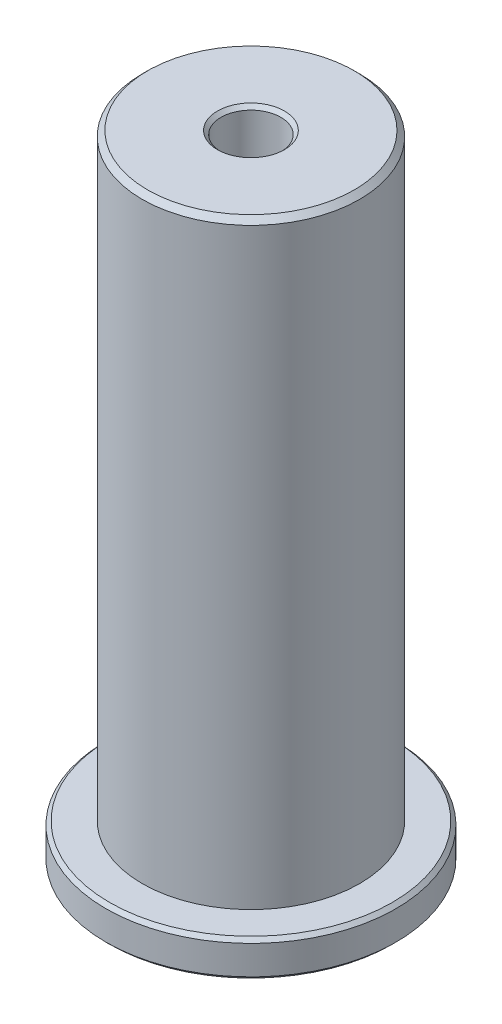
ISO-10303-21;
HEADER;
FILE_DESCRIPTION(('STEP AP214'),'2;1');
FILE_NAME('part.step','',(''),(''),'','','');
FILE_SCHEMA(('AUTOMOTIVE_DESIGN { 1 0 10303 214 1 1 1 1 }'));
ENDSEC;
DATA;
#1=APPLICATION_CONTEXT('core data for automotive mechanical design processes');
#2=APPLICATION_PROTOCOL_DEFINITION('international standard','automotive_design',2000,#1);
#3=PRODUCT_CONTEXT('',#1,'mechanical');
#4=PRODUCT('Part','Part','',(#3));
#5=PRODUCT_RELATED_PRODUCT_CATEGORY('part','',(#4));
#6=PRODUCT_DEFINITION_FORMATION('','',#4);
#7=PRODUCT_DEFINITION_CONTEXT('part definition',#1,'design');
#8=PRODUCT_DEFINITION('design','',#6,#7);
#9=PRODUCT_DEFINITION_SHAPE('','',#8);
#10=(LENGTH_UNIT() NAMED_UNIT(*) SI_UNIT(.MILLI.,.METRE.));
#11=(NAMED_UNIT(*) PLANE_ANGLE_UNIT() SI_UNIT($,.RADIAN.));
#12=(NAMED_UNIT(*) SI_UNIT($,.STERADIAN.) SOLID_ANGLE_UNIT());
#13=UNCERTAINTY_MEASURE_WITH_UNIT(LENGTH_MEASURE(1.E-05),#10,'distance_accuracy_value','');
#14=(GEOMETRIC_REPRESENTATION_CONTEXT(3) GLOBAL_UNCERTAINTY_ASSIGNED_CONTEXT((#13)) GLOBAL_UNIT_ASSIGNED_CONTEXT((#10,
#11,#12)) REPRESENTATION_CONTEXT('',''));
#15=CARTESIAN_POINT('',(0.,0.,0.));
#16=DIRECTION('',(0.,0.,1.));
#17=DIRECTION('',(1.,0.,0.));
#18=AXIS2_PLACEMENT_3D('',#15,#16,#17);
#19=CARTESIAN_POINT('',(0.,2.,0.));
#20=DIRECTION('',(0.,-1.,0.));
#21=DIRECTION('',(0.,0.,-1.));
#22=AXIS2_PLACEMENT_3D('',#19,#20,#21);
#23=CYLINDRICAL_SURFACE('',#22,8.);
#24=CARTESIAN_POINT('',(0.,1.80000000000001,0.));
#25=DIRECTION('',(0.,1.,0.));
#26=DIRECTION('',(0.,0.,1.));
#27=AXIS2_PLACEMENT_3D('',#24,#25,#26);
#28=CIRCLE('',#27,8.);
#29=CARTESIAN_POINT('',(0.,1.80000000000001,8.));
#30=VERTEX_POINT('',#29);
#31=EDGE_CURVE('E169',#30,#30,#28,.F.);
#32=ORIENTED_EDGE('',*,*,#31,.T.);
#33=EDGE_LOOP('',(#32));
#34=FACE_BOUND('',#33,.T.);
#35=CARTESIAN_POINT('',(0.,0.199999999999999,0.));
#36=DIRECTION('',(0.,1.,0.));
#37=DIRECTION('',(0.,0.,1.));
#38=AXIS2_PLACEMENT_3D('',#35,#36,#37);
#39=CIRCLE('',#38,8.);
#40=CARTESIAN_POINT('',(0.,0.199999999999999,8.));
#41=VERTEX_POINT('',#40);
#42=EDGE_CURVE('E165',#41,#41,#39,.T.);
#43=ORIENTED_EDGE('',*,*,#42,.T.);
#44=EDGE_LOOP('',(#43));
#45=FACE_BOUND('',#44,.T.);
#46=ADVANCED_FACE('F52',(#34,#45),#23,.T.);
#47=CARTESIAN_POINT('',(0.,2.,0.));
#48=DIRECTION('',(0.,1.,0.));
#49=DIRECTION('',(0.,0.,1.));
#50=AXIS2_PLACEMENT_3D('',#47,#48,#49);
#51=PLANE('',#50);
#52=CARTESIAN_POINT('',(0.,2.,0.));
#53=DIRECTION('',(0.,1.,0.));
#54=DIRECTION('',(0.,0.,1.));
#55=AXIS2_PLACEMENT_3D('',#52,#53,#54);
#56=CIRCLE('',#55,7.80000000000001);
#57=CARTESIAN_POINT('',(0.,2.,7.80000000000001));
#58=VERTEX_POINT('',#57);
#59=EDGE_CURVE('E161',#58,#58,#56,.T.);
#60=ORIENTED_EDGE('',*,*,#59,.T.);
#61=EDGE_LOOP('',(#60));
#62=FACE_BOUND('',#61,.T.);
#63=CARTESIAN_POINT('',(0.,2.,0.));
#64=DIRECTION('',(0.,1.,0.));
#65=DIRECTION('',(0.,0.,1.));
#66=AXIS2_PLACEMENT_3D('',#63,#64,#65);
#67=CIRCLE('',#66,6.);
#68=CARTESIAN_POINT('',(0.,2.,6.));
#69=VERTEX_POINT('',#68);
#70=EDGE_CURVE('E141',#69,#69,#67,.T.);
#71=ORIENTED_EDGE('',*,*,#70,.F.);
#72=EDGE_LOOP('',(#71));
#73=FACE_BOUND('',#72,.T.);
#74=ADVANCED_FACE('F193',(#62,#73),#51,.T.);
#75=CARTESIAN_POINT('',(0.,0.,0.));
#76=DIRECTION('',(0.,1.,0.));
#77=DIRECTION('',(0.,0.,1.));
#78=AXIS2_PLACEMENT_3D('',#75,#76,#77);
#79=PLANE('',#78);
#80=CARTESIAN_POINT('',(0.,0.,0.));
#81=DIRECTION('',(0.,1.,0.));
#82=DIRECTION('',(0.,0.,1.));
#83=AXIS2_PLACEMENT_3D('',#80,#81,#82);
#84=CIRCLE('',#83,7.8);
#85=CARTESIAN_POINT('',(0.,0.,7.8));
#86=VERTEX_POINT('',#85);
#87=EDGE_CURVE('E173',#86,#86,#84,.F.);
#88=ORIENTED_EDGE('',*,*,#87,.T.);
#89=EDGE_LOOP('',(#88));
#90=FACE_BOUND('',#89,.T.);
#91=DIRECTION('',(0.,0.,-1.));
#92=VECTOR('',#91,1.);
#93=CARTESIAN_POINT('',(-1.,0.,0.));
#94=LINE('',#93,#92);
#95=CARTESIAN_POINT('',(-1.,0.,3.));
#96=VERTEX_POINT('',#95);
#97=CARTESIAN_POINT('',(-1.,0.,-3.));
#98=VERTEX_POINT('',#97);
#99=EDGE_CURVE('E111',#96,#98,#94,.T.);
#100=ORIENTED_EDGE('',*,*,#99,.F.);
#101=CARTESIAN_POINT('',(0.,0.,3.));
#102=DIRECTION('',(0.,-1.,0.));
#103=DIRECTION('',(0.,0.,-1.));
#104=AXIS2_PLACEMENT_3D('',#101,#102,#103);
#105=CIRCLE('',#104,1.);
#106=CARTESIAN_POINT('',(0.999999999999999,0.,3.));
#107=VERTEX_POINT('',#106);
#108=EDGE_CURVE('E69',#107,#96,#105,.T.);
#109=ORIENTED_EDGE('',*,*,#108,.F.);
#110=DIRECTION('',(0.,0.,-1.));
#111=VECTOR('',#110,1.);
#112=CARTESIAN_POINT('',(1.,0.,0.));
#113=LINE('',#112,#111);
#114=CARTESIAN_POINT('',(1.,0.,-3.));
#115=VERTEX_POINT('',#114);
#116=EDGE_CURVE('E119',#107,#115,#113,.T.);
#117=ORIENTED_EDGE('',*,*,#116,.T.);
#118=CARTESIAN_POINT('',(0.,0.,-3.));
#119=DIRECTION('',(0.,-1.,0.));
#120=DIRECTION('',(0.,0.,-1.));
#121=AXIS2_PLACEMENT_3D('',#118,#119,#120);
#122=CIRCLE('',#121,1.);
#123=EDGE_CURVE('E132',#98,#115,#122,.T.);
#124=ORIENTED_EDGE('',*,*,#123,.F.);
#125=EDGE_LOOP('',(#100,#109,#117,#124));
#126=FACE_BOUND('',#125,.T.);
#127=ADVANCED_FACE('F199',(#90,#126),#79,.F.);
#128=CARTESIAN_POINT('',(0.,35.,0.));
#129=DIRECTION('',(0.,-1.,0.));
#130=DIRECTION('',(0.,0.,-1.));
#131=AXIS2_PLACEMENT_3D('',#128,#129,#130);
#132=CYLINDRICAL_SURFACE('',#131,6.);
#133=CARTESIAN_POINT('',(0.,34.7,0.));
#134=DIRECTION('',(0.,1.,0.));
#135=DIRECTION('',(0.,0.,1.));
#136=AXIS2_PLACEMENT_3D('',#133,#134,#135);
#137=CIRCLE('',#136,6.);
#138=CARTESIAN_POINT('',(0.,34.7,6.));
#139=VERTEX_POINT('',#138);
#140=EDGE_CURVE('E11',#139,#139,#137,.F.);
#141=ORIENTED_EDGE('',*,*,#140,.T.);
#142=EDGE_LOOP('',(#141));
#143=FACE_BOUND('',#142,.T.);
#144=ORIENTED_EDGE('',*,*,#70,.T.);
#145=EDGE_LOOP('',(#144));
#146=FACE_BOUND('',#145,.T.);
#147=ADVANCED_FACE('F231',(#143,#146),#132,.T.);
#148=CARTESIAN_POINT('',(0.,35.,0.));
#149=DIRECTION('',(0.,1.,0.));
#150=DIRECTION('',(0.,0.,1.));
#151=AXIS2_PLACEMENT_3D('',#148,#149,#150);
#152=PLANE('',#151);
#153=CARTESIAN_POINT('',(0.,35.,0.));
#154=DIRECTION('',(0.,1.,0.));
#155=DIRECTION('',(0.,0.,1.));
#156=AXIS2_PLACEMENT_3D('',#153,#154,#155);
#157=CIRCLE('',#156,5.7);
#158=CARTESIAN_POINT('',(0.,35.,5.7));
#159=VERTEX_POINT('',#158);
#160=EDGE_CURVE('E62',#159,#159,#157,.T.);
#161=ORIENTED_EDGE('',*,*,#160,.T.);
#162=EDGE_LOOP('',(#161));
#163=FACE_BOUND('',#162,.T.);
#164=CARTESIAN_POINT('',(0.,35.,0.));
#165=DIRECTION('',(0.,1.,0.));
#166=DIRECTION('',(0.,0.,1.));
#167=AXIS2_PLACEMENT_3D('',#164,#165,#166);
#168=CIRCLE('',#167,1.85);
#169=CARTESIAN_POINT('',(0.,35.,1.85));
#170=VERTEX_POINT('',#169);
#171=EDGE_CURVE('E157',#170,#170,#168,.F.);
#172=ORIENTED_EDGE('',*,*,#171,.T.);
#173=EDGE_LOOP('',(#172));
#174=FACE_BOUND('',#173,.T.);
#175=ADVANCED_FACE('F180',(#163,#174),#152,.T.);
#176=CARTESIAN_POINT('',(0.,2.,3.));
#177=DIRECTION('',(0.,-1.,0.));
#178=DIRECTION('',(0.,0.,-1.));
#179=AXIS2_PLACEMENT_3D('',#176,#177,#178);
#180=CYLINDRICAL_SURFACE('',#179,1.);
#181=ORIENTED_EDGE('',*,*,#108,.T.);
#182=DIRECTION('',(0.,-1.,0.));
#183=VECTOR('',#182,1.);
#184=CARTESIAN_POINT('',(-1.,2.,3.));
#185=LINE('',#184,#183);
#186=CARTESIAN_POINT('',(-1.,2.,3.));
#187=VERTEX_POINT('',#186);
#188=EDGE_CURVE('E93',#187,#96,#185,.T.);
#189=ORIENTED_EDGE('',*,*,#188,.F.);
#190=CARTESIAN_POINT('',(0.,2.,3.));
#191=DIRECTION('',(0.,-1.,0.));
#192=DIRECTION('',(0.,0.,-1.));
#193=AXIS2_PLACEMENT_3D('',#190,#191,#192);
#194=CIRCLE('',#193,1.);
#195=CARTESIAN_POINT('',(0.999999999999999,2.,3.));
#196=VERTEX_POINT('',#195);
#197=EDGE_CURVE('E114',#196,#187,#194,.T.);
#198=ORIENTED_EDGE('',*,*,#197,.F.);
#199=DIRECTION('',(0.,-1.,0.));
#200=VECTOR('',#199,1.);
#201=CARTESIAN_POINT('',(0.999999999999999,2.,3.));
#202=LINE('',#201,#200);
#203=EDGE_CURVE('E77',#196,#107,#202,.T.);
#204=ORIENTED_EDGE('',*,*,#203,.T.);
#205=EDGE_LOOP('',(#181,#189,#198,#204));
#206=FACE_BOUND('',#205,.T.);
#207=ADVANCED_FACE('F239',(#206),#180,.F.);
#208=CARTESIAN_POINT('',(1.,2.,0.));
#209=DIRECTION('',(-1.,0.,0.));
#210=DIRECTION('',(0.,0.,1.));
#211=AXIS2_PLACEMENT_3D('',#208,#209,#210);
#212=PLANE('',#211);
#213=ORIENTED_EDGE('',*,*,#116,.F.);
#214=ORIENTED_EDGE('',*,*,#203,.F.);
#215=DIRECTION('',(0.,0.,-1.));
#216=VECTOR('',#215,1.);
#217=CARTESIAN_POINT('',(1.,2.,0.));
#218=LINE('',#217,#216);
#219=CARTESIAN_POINT('',(1.,2.,-3.));
#220=VERTEX_POINT('',#219);
#221=EDGE_CURVE('E127',#196,#220,#218,.T.);
#222=ORIENTED_EDGE('',*,*,#221,.T.);
#223=DIRECTION('',(0.,-1.,0.));
#224=VECTOR('',#223,1.);
#225=CARTESIAN_POINT('',(1.,2.,-3.));
#226=LINE('',#225,#224);
#227=EDGE_CURVE('E142',#220,#115,#226,.T.);
#228=ORIENTED_EDGE('',*,*,#227,.T.);
#229=EDGE_LOOP('',(#213,#214,#222,#228));
#230=FACE_BOUND('',#229,.T.);
#231=ADVANCED_FACE('F245',(#230),#212,.T.);
#232=CARTESIAN_POINT('',(0.,2.,-3.));
#233=DIRECTION('',(0.,-1.,0.));
#234=DIRECTION('',(0.,0.,-1.));
#235=AXIS2_PLACEMENT_3D('',#232,#233,#234);
#236=CYLINDRICAL_SURFACE('',#235,1.);
#237=ORIENTED_EDGE('',*,*,#123,.T.);
#238=ORIENTED_EDGE('',*,*,#227,.F.);
#239=CARTESIAN_POINT('',(0.,2.,-3.));
#240=DIRECTION('',(0.,-1.,0.));
#241=DIRECTION('',(0.,0.,-1.));
#242=AXIS2_PLACEMENT_3D('',#239,#240,#241);
#243=CIRCLE('',#242,1.);
#244=CARTESIAN_POINT('',(-1.,2.,-3.));
#245=VERTEX_POINT('',#244);
#246=EDGE_CURVE('E123',#245,#220,#243,.T.);
#247=ORIENTED_EDGE('',*,*,#246,.F.);
#248=DIRECTION('',(0.,-1.,0.));
#249=VECTOR('',#248,1.);
#250=CARTESIAN_POINT('',(-1.,2.,-3.));
#251=LINE('',#250,#249);
#252=EDGE_CURVE('E145',#245,#98,#251,.T.);
#253=ORIENTED_EDGE('',*,*,#252,.T.);
#254=EDGE_LOOP('',(#237,#238,#247,#253));
#255=FACE_BOUND('',#254,.T.);
#256=ADVANCED_FACE('F250',(#255),#236,.F.);
#257=CARTESIAN_POINT('',(-1.,2.,0.));
#258=DIRECTION('',(-1.,0.,0.));
#259=DIRECTION('',(0.,0.,1.));
#260=AXIS2_PLACEMENT_3D('',#257,#258,#259);
#261=PLANE('',#260);
#262=ORIENTED_EDGE('',*,*,#99,.T.);
#263=ORIENTED_EDGE('',*,*,#252,.F.);
#264=DIRECTION('',(0.,0.,-1.));
#265=VECTOR('',#264,1.);
#266=CARTESIAN_POINT('',(-1.,2.,0.));
#267=LINE('',#266,#265);
#268=EDGE_CURVE('E118',#187,#245,#267,.T.);
#269=ORIENTED_EDGE('',*,*,#268,.F.);
#270=ORIENTED_EDGE('',*,*,#188,.T.);
#271=EDGE_LOOP('',(#262,#263,#269,#270));
#272=FACE_BOUND('',#271,.T.);
#273=ADVANCED_FACE('F246',(#272),#261,.F.);
#274=CARTESIAN_POINT('',(0.,2.,0.));
#275=DIRECTION('',(0.,-1.,0.));
#276=DIRECTION('',(0.,0.,-1.));
#277=AXIS2_PLACEMENT_3D('',#274,#275,#276);
#278=PLANE('',#277);
#279=ORIENTED_EDGE('',*,*,#197,.T.);
#280=ORIENTED_EDGE('',*,*,#268,.T.);
#281=ORIENTED_EDGE('',*,*,#246,.T.);
#282=ORIENTED_EDGE('',*,*,#221,.F.);
#283=EDGE_LOOP('',(#279,#280,#281,#282));
#284=FACE_BOUND('',#283,.T.);
#285=ADVANCED_FACE('F249',(#284),#278,.T.);
#286=CARTESIAN_POINT('',(0.,22.,0.));
#287=DIRECTION('',(0.,1.,0.));
#288=DIRECTION('',(0.,0.,1.));
#289=AXIS2_PLACEMENT_3D('',#286,#287,#288);
#290=CYLINDRICAL_SURFACE('',#289,1.65);
#291=CARTESIAN_POINT('',(0.,34.8,0.));
#292=DIRECTION('',(0.,1.,0.));
#293=DIRECTION('',(0.,0.,1.));
#294=AXIS2_PLACEMENT_3D('',#291,#292,#293);
#295=CIRCLE('',#294,1.65);
#296=CARTESIAN_POINT('',(0.,34.8,1.65));
#297=VERTEX_POINT('',#296);
#298=EDGE_CURVE('E153',#297,#297,#295,.T.);
#299=CARTESIAN_POINT('',(0.,22.,0.));
#300=DIRECTION('',(0.,-1.,0.));
#301=DIRECTION('',(0.,0.,-1.));
#302=AXIS2_PLACEMENT_3D('',#299,#300,#301);
#303=CIRCLE('',#302,1.65);
#304=CARTESIAN_POINT('',(0.,22.,1.65));
#305=VERTEX_POINT('',#304);
#306=EDGE_CURVE('E105',#305,#305,#303,.T.);
#307=CARTESIAN_POINT('',(0.,34.8,1.65));
#308=CARTESIAN_POINT('',(0.,34.6666666666667,1.65));
#309=CARTESIAN_POINT('',(0.,34.5333333333333,1.65));
#310=CARTESIAN_POINT('',(0.,34.2666666666667,1.65));
#311=CARTESIAN_POINT('',(0.,34.1333333333333,1.65));
#312=CARTESIAN_POINT('',(0.,33.8666666666667,1.65));
#313=CARTESIAN_POINT('',(0.,33.7333333333333,1.65));
#314=CARTESIAN_POINT('',(0.,33.4666666666667,1.65));
#315=CARTESIAN_POINT('',(0.,33.3333333333333,1.65));
#316=CARTESIAN_POINT('',(0.,33.0666666666667,1.65));
#317=CARTESIAN_POINT('',(0.,32.9333333333333,1.65));
#318=CARTESIAN_POINT('',(0.,32.6666666666667,1.65));
#319=CARTESIAN_POINT('',(0.,32.5333333333333,1.65));
#320=CARTESIAN_POINT('',(0.,32.2666666666667,1.65));
#321=CARTESIAN_POINT('',(0.,32.1333333333333,1.65));
#322=CARTESIAN_POINT('',(0.,31.8666666666667,1.65));
#323=CARTESIAN_POINT('',(0.,31.7333333333333,1.65));
#324=CARTESIAN_POINT('',(0.,31.4666666666667,1.65));
#325=CARTESIAN_POINT('',(0.,31.3333333333333,1.65));
#326=CARTESIAN_POINT('',(0.,31.0666666666667,1.65));
#327=CARTESIAN_POINT('',(0.,30.9333333333333,1.65));
#328=CARTESIAN_POINT('',(0.,30.6666666666667,1.65));
#329=CARTESIAN_POINT('',(0.,30.5333333333333,1.65));
#330=CARTESIAN_POINT('',(0.,30.2666666666667,1.65));
#331=CARTESIAN_POINT('',(0.,30.1333333333333,1.65));
#332=CARTESIAN_POINT('',(0.,29.8666666666667,1.65));
#333=CARTESIAN_POINT('',(0.,29.7333333333333,1.65));
#334=CARTESIAN_POINT('',(0.,29.4666666666667,1.65));
#335=CARTESIAN_POINT('',(0.,29.3333333333333,1.65));
#336=CARTESIAN_POINT('',(0.,29.0666666666667,1.65));
#337=CARTESIAN_POINT('',(0.,28.9333333333333,1.65));
#338=CARTESIAN_POINT('',(0.,28.6666666666667,1.65));
#339=CARTESIAN_POINT('',(0.,28.5333333333333,1.65));
#340=CARTESIAN_POINT('',(0.,28.2666666666667,1.65));
#341=CARTESIAN_POINT('',(0.,28.1333333333333,1.65));
#342=CARTESIAN_POINT('',(0.,27.8666666666667,1.65));
#343=CARTESIAN_POINT('',(0.,27.7333333333333,1.65));
#344=CARTESIAN_POINT('',(0.,27.4666666666667,1.65));
#345=CARTESIAN_POINT('',(0.,27.3333333333333,1.65));
#346=CARTESIAN_POINT('',(0.,27.0666666666667,1.65));
#347=CARTESIAN_POINT('',(0.,26.9333333333333,1.65));
#348=CARTESIAN_POINT('',(0.,26.6666666666667,1.65));
#349=CARTESIAN_POINT('',(0.,26.5333333333333,1.65));
#350=CARTESIAN_POINT('',(0.,26.2666666666667,1.65));
#351=CARTESIAN_POINT('',(0.,26.1333333333333,1.65));
#352=CARTESIAN_POINT('',(0.,25.8666666666667,1.65));
#353=CARTESIAN_POINT('',(0.,25.7333333333333,1.65));
#354=CARTESIAN_POINT('',(0.,25.4666666666667,1.65));
#355=CARTESIAN_POINT('',(0.,25.3333333333333,1.65));
#356=CARTESIAN_POINT('',(0.,25.0666666666667,1.65));
#357=CARTESIAN_POINT('',(0.,24.9333333333333,1.65));
#358=CARTESIAN_POINT('',(0.,24.6666666666667,1.65));
#359=CARTESIAN_POINT('',(0.,24.5333333333333,1.65));
#360=CARTESIAN_POINT('',(0.,24.2666666666667,1.65));
#361=CARTESIAN_POINT('',(0.,24.1333333333333,1.65));
#362=CARTESIAN_POINT('',(0.,23.8666666666667,1.65));
#363=CARTESIAN_POINT('',(0.,23.7333333333333,1.65));
#364=CARTESIAN_POINT('',(0.,23.4666666666667,1.65));
#365=CARTESIAN_POINT('',(0.,23.3333333333333,1.65));
#366=CARTESIAN_POINT('',(0.,23.0666666666667,1.65));
#367=CARTESIAN_POINT('',(0.,22.9333333333333,1.65));
#368=CARTESIAN_POINT('',(0.,22.6666666666667,1.65));
#369=CARTESIAN_POINT('',(0.,22.5333333333333,1.65));
#370=CARTESIAN_POINT('',(0.,22.2666666666667,1.65));
#371=CARTESIAN_POINT('',(0.,22.1333333333333,1.65));
#372=CARTESIAN_POINT('',(0.,22.,1.65));
#373=B_SPLINE_CURVE_WITH_KNOTS('',3,(#307,#308,#309,#310,#311,#312,#313,#314,#315,#316,#317,
#318,#319,#320,#321,#322,#323,#324,#325,#326,#327,#328,#329,#330,#331,#332,#333,#334,#335,#336,
#337,#338,#339,#340,#341,#342,#343,#344,#345,#346,#347,#348,#349,#350,#351,#352,#353,#354,#355,
#356,#357,#358,#359,#360,#361,#362,#363,#364,#365,#366,#367,#368,#369,#370,#371,#372),
.UNSPECIFIED.,.F.,.F.,(4,2,2,2,2,2,2,2,2,2,2,2,2,2,2,2,2,2,2,2,2,2,2,2,2,2,2,2,2,2,2,2,4),(0.,
0.400000000000005,0.800000000000002,1.2,1.6,2.,2.4,2.8,3.2,3.6,4.,4.4,4.8,5.2,5.6,6.,6.4,6.8,
7.2,7.6,8.,8.4,8.8,9.2,9.6,10.,10.4,10.8,11.2,11.6,12.,12.4,12.8),.UNSPECIFIED.);
#374=EDGE_CURVE('BSEAM212',#297,#305,#373,.T.);
#375=ORIENTED_EDGE('',*,*,#298,.T.);
#376=ORIENTED_EDGE('',*,*,#306,.T.);
#377=ORIENTED_EDGE('',*,*,#374,.T.);
#378=ORIENTED_EDGE('',*,*,#374,.F.);
#379=EDGE_LOOP('',(#375,#377,#376,#378));
#380=FACE_BOUND('',#379,.T.);
#381=ADVANCED_FACE('F212',(#380),#290,.F.);
#382=CARTESIAN_POINT('',(0.,34.8,0.));
#383=DIRECTION('',(0.,1.,0.));
#384=DIRECTION('',(0.,0.,1.));
#385=AXIS2_PLACEMENT_3D('',#382,#383,#384);
#386=CONICAL_SURFACE('',#385,1.65,0.785398163397458);
#387=ORIENTED_EDGE('',*,*,#171,.F.);
#388=EDGE_LOOP('',(#387));
#389=FACE_BOUND('',#388,.T.);
#390=ORIENTED_EDGE('',*,*,#298,.F.);
#391=EDGE_LOOP('',(#390));
#392=FACE_BOUND('',#391,.T.);
#393=ADVANCED_FACE('F206',(#389,#392),#386,.F.);
#394=CARTESIAN_POINT('',(0.,2.,0.));
#395=DIRECTION('',(0.,-1.,0.));
#396=DIRECTION('',(0.,0.,-1.));
#397=AXIS2_PLACEMENT_3D('',#394,#395,#396);
#398=CONICAL_SURFACE('',#397,7.80000000000001,0.785398163397457);
#399=ORIENTED_EDGE('',*,*,#31,.F.);
#400=EDGE_LOOP('',(#399));
#401=FACE_BOUND('',#400,.T.);
#402=ORIENTED_EDGE('',*,*,#59,.F.);
#403=EDGE_LOOP('',(#402));
#404=FACE_BOUND('',#403,.T.);
#405=ADVANCED_FACE('F189',(#401,#404),#398,.T.);
#406=CARTESIAN_POINT('',(0.,0.199999999999999,0.));
#407=DIRECTION('',(0.,1.,0.));
#408=DIRECTION('',(0.,0.,1.));
#409=AXIS2_PLACEMENT_3D('',#406,#407,#408);
#410=CONICAL_SURFACE('',#409,8.,0.785398163397457);
#411=ORIENTED_EDGE('',*,*,#87,.F.);
#412=EDGE_LOOP('',(#411));
#413=FACE_BOUND('',#412,.T.);
#414=ORIENTED_EDGE('',*,*,#42,.F.);
#415=EDGE_LOOP('',(#414));
#416=FACE_BOUND('',#415,.T.);
#417=ADVANCED_FACE('F184',(#413,#416),#410,.T.);
#418=CARTESIAN_POINT('',(0.,35.,0.));
#419=DIRECTION('',(0.,-1.,0.));
#420=DIRECTION('',(0.,0.,-1.));
#421=AXIS2_PLACEMENT_3D('',#418,#419,#420);
#422=CONICAL_SURFACE('',#421,5.7,0.785398163397453);
#423=ORIENTED_EDGE('',*,*,#140,.F.);
#424=EDGE_LOOP('',(#423));
#425=FACE_BOUND('',#424,.T.);
#426=ORIENTED_EDGE('',*,*,#160,.F.);
#427=EDGE_LOOP('',(#426));
#428=FACE_BOUND('',#427,.T.);
#429=ADVANCED_FACE('F55',(#425,#428),#422,.T.);
#430=CARTESIAN_POINT('',(0.,22.,0.));
#431=DIRECTION('',(0.,1.,0.));
#432=DIRECTION('',(0.,0.,1.));
#433=AXIS2_PLACEMENT_3D('',#430,#431,#432);
#434=CONICAL_SURFACE('',#433,1.65,1.17809724509617);
#435=CARTESIAN_POINT('',(0.,21.3165476220844,0.));
#436=VERTEX_POINT('',#435);
#437=VERTEX_LOOP('',#436);
#438=FACE_BOUND('',#437,.T.);
#439=ORIENTED_EDGE('',*,*,#306,.F.);
#440=EDGE_LOOP('',(#439));
#441=FACE_BOUND('',#440,.T.);
#442=ADVANCED_FACE('F99',(#438,#441),#434,.F.);
#443=CLOSED_SHELL('',(#46,#74,#127,#147,#175,#207,#231,#256,#273,#285,#381,#393,#405,#417,#429,#442));
#444=MANIFOLD_SOLID_BREP('B2',#443);
#445=ADVANCED_BREP_SHAPE_REPRESENTATION('',(#18,#444),#14);
#446=SHAPE_DEFINITION_REPRESENTATION(#9,#445);
ENDSEC;
END-ISO-10303-21;
